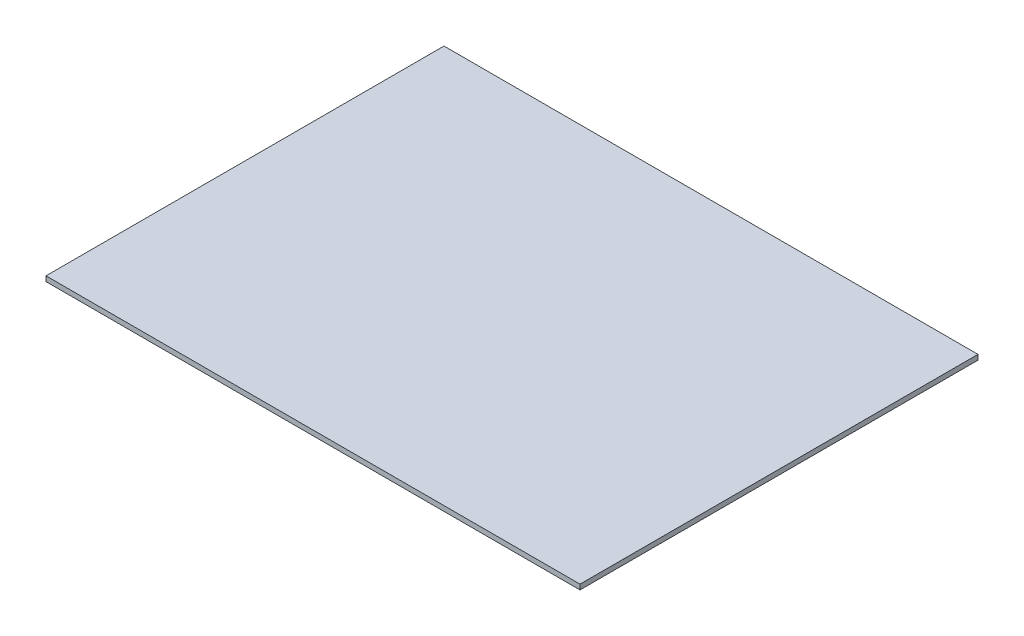
ISO-10303-21;
HEADER;
FILE_DESCRIPTION(('STEP AP214'),'2;1');
FILE_NAME('part.step','',(''),(''),'','','');
FILE_SCHEMA(('AUTOMOTIVE_DESIGN { 1 0 10303 214 1 1 1 1 }'));
ENDSEC;
DATA;
#1=APPLICATION_CONTEXT('core data for automotive mechanical design processes');
#2=APPLICATION_PROTOCOL_DEFINITION('international standard','automotive_design',2000,#1);
#3=PRODUCT_CONTEXT('',#1,'mechanical');
#4=PRODUCT('Part','Part','',(#3));
#5=PRODUCT_RELATED_PRODUCT_CATEGORY('part','',(#4));
#6=PRODUCT_DEFINITION_FORMATION('','',#4);
#7=PRODUCT_DEFINITION_CONTEXT('part definition',#1,'design');
#8=PRODUCT_DEFINITION('design','',#6,#7);
#9=PRODUCT_DEFINITION_SHAPE('','',#8);
#10=(LENGTH_UNIT() NAMED_UNIT(*) SI_UNIT(.MILLI.,.METRE.));
#11=(NAMED_UNIT(*) PLANE_ANGLE_UNIT() SI_UNIT($,.RADIAN.));
#12=(NAMED_UNIT(*) SI_UNIT($,.STERADIAN.) SOLID_ANGLE_UNIT());
#13=UNCERTAINTY_MEASURE_WITH_UNIT(LENGTH_MEASURE(1.E-05),#10,'distance_accuracy_value','');
#14=(GEOMETRIC_REPRESENTATION_CONTEXT(3) GLOBAL_UNCERTAINTY_ASSIGNED_CONTEXT((#13)) GLOBAL_UNIT_ASSIGNED_CONTEXT((#10,
#11,#12)) REPRESENTATION_CONTEXT('',''));
#15=CARTESIAN_POINT('',(0.,0.,0.));
#16=DIRECTION('',(0.,0.,1.));
#17=DIRECTION('',(1.,0.,0.));
#18=AXIS2_PLACEMENT_3D('',#15,#16,#17);
#19=CARTESIAN_POINT('',(0.,6.35,0.));
#20=DIRECTION('',(0.,1.,0.));
#21=DIRECTION('',(0.,0.,1.));
#22=AXIS2_PLACEMENT_3D('',#19,#20,#21);
#23=PLANE('',#22);
#24=DIRECTION('',(-1.,0.,0.));
#25=VECTOR('',#24,1.);
#26=CARTESIAN_POINT('',(673.1,6.35,-501.65));
#27=LINE('',#26,#25);
#28=CARTESIAN_POINT('',(0.,6.35,-501.65));
#29=VERTEX_POINT('',#28);
#30=CARTESIAN_POINT('',(673.1,6.35,-501.65));
#31=VERTEX_POINT('',#30);
#32=EDGE_CURVE('E57',#29,#31,#27,.F.);
#33=ORIENTED_EDGE('',*,*,#32,.F.);
#34=DIRECTION('',(0.,0.,1.));
#35=VECTOR('',#34,1.);
#36=CARTESIAN_POINT('',(0.,6.35,-501.65));
#37=LINE('',#36,#35);
#38=CARTESIAN_POINT('',(0.,6.35,0.));
#39=VERTEX_POINT('',#38);
#40=EDGE_CURVE('E52',#39,#29,#37,.F.);
#41=ORIENTED_EDGE('',*,*,#40,.F.);
#42=DIRECTION('',(1.,0.,0.));
#43=VECTOR('',#42,1.);
#44=CARTESIAN_POINT('',(0.,6.35,0.));
#45=LINE('',#44,#43);
#46=CARTESIAN_POINT('',(673.1,6.35,0.));
#47=VERTEX_POINT('',#46);
#48=EDGE_CURVE('E67',#47,#39,#45,.F.);
#49=ORIENTED_EDGE('',*,*,#48,.F.);
#50=DIRECTION('',(0.,0.,-1.));
#51=VECTOR('',#50,1.);
#52=CARTESIAN_POINT('',(673.1,6.35,0.));
#53=LINE('',#52,#51);
#54=EDGE_CURVE('E19',#31,#47,#53,.F.);
#55=ORIENTED_EDGE('',*,*,#54,.F.);
#56=EDGE_LOOP('',(#33,#41,#49,#55));
#57=FACE_BOUND('',#56,.T.);
#58=ADVANCED_FACE('F16',(#57),#23,.T.);
#59=CARTESIAN_POINT('',(673.1,0.,0.));
#60=DIRECTION('',(1.,0.,0.));
#61=DIRECTION('',(0.,0.,-1.));
#62=AXIS2_PLACEMENT_3D('',#59,#60,#61);
#63=PLANE('',#62);
#64=ORIENTED_EDGE('',*,*,#54,.T.);
#65=DIRECTION('',(0.,1.,0.));
#66=VECTOR('',#65,1.);
#67=CARTESIAN_POINT('',(673.1,0.,0.));
#68=LINE('',#67,#66);
#69=CARTESIAN_POINT('',(673.1,0.,0.));
#70=VERTEX_POINT('',#69);
#71=EDGE_CURVE('E78',#70,#47,#68,.T.);
#72=ORIENTED_EDGE('',*,*,#71,.F.);
#73=DIRECTION('',(0.,0.,1.));
#74=VECTOR('',#73,1.);
#75=CARTESIAN_POINT('',(673.1,0.,0.));
#76=LINE('',#75,#74);
#77=CARTESIAN_POINT('',(673.1,0.,-501.65));
#78=VERTEX_POINT('',#77);
#79=EDGE_CURVE('E73',#70,#78,#76,.F.);
#80=ORIENTED_EDGE('',*,*,#79,.T.);
#81=DIRECTION('',(0.,1.,0.));
#82=VECTOR('',#81,1.);
#83=CARTESIAN_POINT('',(673.1,0.,-501.65));
#84=LINE('',#83,#82);
#85=EDGE_CURVE('E62',#31,#78,#84,.F.);
#86=ORIENTED_EDGE('',*,*,#85,.F.);
#87=EDGE_LOOP('',(#64,#72,#80,#86));
#88=FACE_BOUND('',#87,.T.);
#89=ADVANCED_FACE('F72',(#88),#63,.T.);
#90=CARTESIAN_POINT('',(673.1,0.,-501.65));
#91=DIRECTION('',(0.,0.,-1.));
#92=DIRECTION('',(-1.,0.,0.));
#93=AXIS2_PLACEMENT_3D('',#90,#91,#92);
#94=PLANE('',#93);
#95=ORIENTED_EDGE('',*,*,#32,.T.);
#96=ORIENTED_EDGE('',*,*,#85,.T.);
#97=DIRECTION('',(1.,0.,0.));
#98=VECTOR('',#97,1.);
#99=CARTESIAN_POINT('',(0.,0.,-501.65));
#100=LINE('',#99,#98);
#101=CARTESIAN_POINT('',(0.,0.,-501.65));
#102=VERTEX_POINT('',#101);
#103=EDGE_CURVE('E83',#78,#102,#100,.F.);
#104=ORIENTED_EDGE('',*,*,#103,.T.);
#105=DIRECTION('',(0.,1.,0.));
#106=VECTOR('',#105,1.);
#107=CARTESIAN_POINT('',(0.,0.,-501.65));
#108=LINE('',#107,#106);
#109=EDGE_CURVE('E64',#29,#102,#108,.F.);
#110=ORIENTED_EDGE('',*,*,#109,.F.);
#111=EDGE_LOOP('',(#95,#96,#104,#110));
#112=FACE_BOUND('',#111,.T.);
#113=ADVANCED_FACE('F59',(#112),#94,.T.);
#114=CARTESIAN_POINT('',(0.,0.,-501.65));
#115=DIRECTION('',(-1.,0.,0.));
#116=DIRECTION('',(0.,0.,1.));
#117=AXIS2_PLACEMENT_3D('',#114,#115,#116);
#118=PLANE('',#117);
#119=ORIENTED_EDGE('',*,*,#40,.T.);
#120=ORIENTED_EDGE('',*,*,#109,.T.);
#121=DIRECTION('',(0.,0.,1.));
#122=VECTOR('',#121,1.);
#123=CARTESIAN_POINT('',(0.,0.,0.));
#124=LINE('',#123,#122);
#125=CARTESIAN_POINT('',(0.,0.,0.));
#126=VERTEX_POINT('',#125);
#127=EDGE_CURVE('E25',#102,#126,#124,.T.);
#128=ORIENTED_EDGE('',*,*,#127,.T.);
#129=DIRECTION('',(0.,1.,0.));
#130=VECTOR('',#129,1.);
#131=CARTESIAN_POINT('',(0.,0.,0.));
#132=LINE('',#131,#130);
#133=EDGE_CURVE('E33',#39,#126,#132,.F.);
#134=ORIENTED_EDGE('',*,*,#133,.F.);
#135=EDGE_LOOP('',(#119,#120,#128,#134));
#136=FACE_BOUND('',#135,.T.);
#137=ADVANCED_FACE('F87',(#136),#118,.T.);
#138=CARTESIAN_POINT('',(0.,0.,0.));
#139=DIRECTION('',(0.,0.,1.));
#140=DIRECTION('',(1.,0.,0.));
#141=AXIS2_PLACEMENT_3D('',#138,#139,#140);
#142=PLANE('',#141);
#143=ORIENTED_EDGE('',*,*,#48,.T.);
#144=ORIENTED_EDGE('',*,*,#133,.T.);
#145=DIRECTION('',(1.,0.,0.));
#146=VECTOR('',#145,1.);
#147=CARTESIAN_POINT('',(0.,0.,0.));
#148=LINE('',#147,#146);
#149=EDGE_CURVE('E11',#126,#70,#148,.T.);
#150=ORIENTED_EDGE('',*,*,#149,.T.);
#151=ORIENTED_EDGE('',*,*,#71,.T.);
#152=EDGE_LOOP('',(#143,#144,#150,#151));
#153=FACE_BOUND('',#152,.T.);
#154=ADVANCED_FACE('F90',(#153),#142,.T.);
#155=CARTESIAN_POINT('',(0.,0.,0.));
#156=DIRECTION('',(0.,1.,0.));
#157=DIRECTION('',(0.,0.,1.));
#158=AXIS2_PLACEMENT_3D('',#155,#156,#157);
#159=PLANE('',#158);
#160=ORIENTED_EDGE('',*,*,#127,.F.);
#161=ORIENTED_EDGE('',*,*,#103,.F.);
#162=ORIENTED_EDGE('',*,*,#79,.F.);
#163=ORIENTED_EDGE('',*,*,#149,.F.);
#164=EDGE_LOOP('',(#160,#161,#162,#163));
#165=FACE_BOUND('',#164,.T.);
#166=ADVANCED_FACE('F89',(#165),#159,.F.);
#167=CLOSED_SHELL('',(#58,#89,#113,#137,#154,#166));
#168=MANIFOLD_SOLID_BREP('B1',#167);
#169=ADVANCED_BREP_SHAPE_REPRESENTATION('',(#18,#168),#14);
#170=SHAPE_DEFINITION_REPRESENTATION(#9,#169);
ENDSEC;
END-ISO-10303-21;
